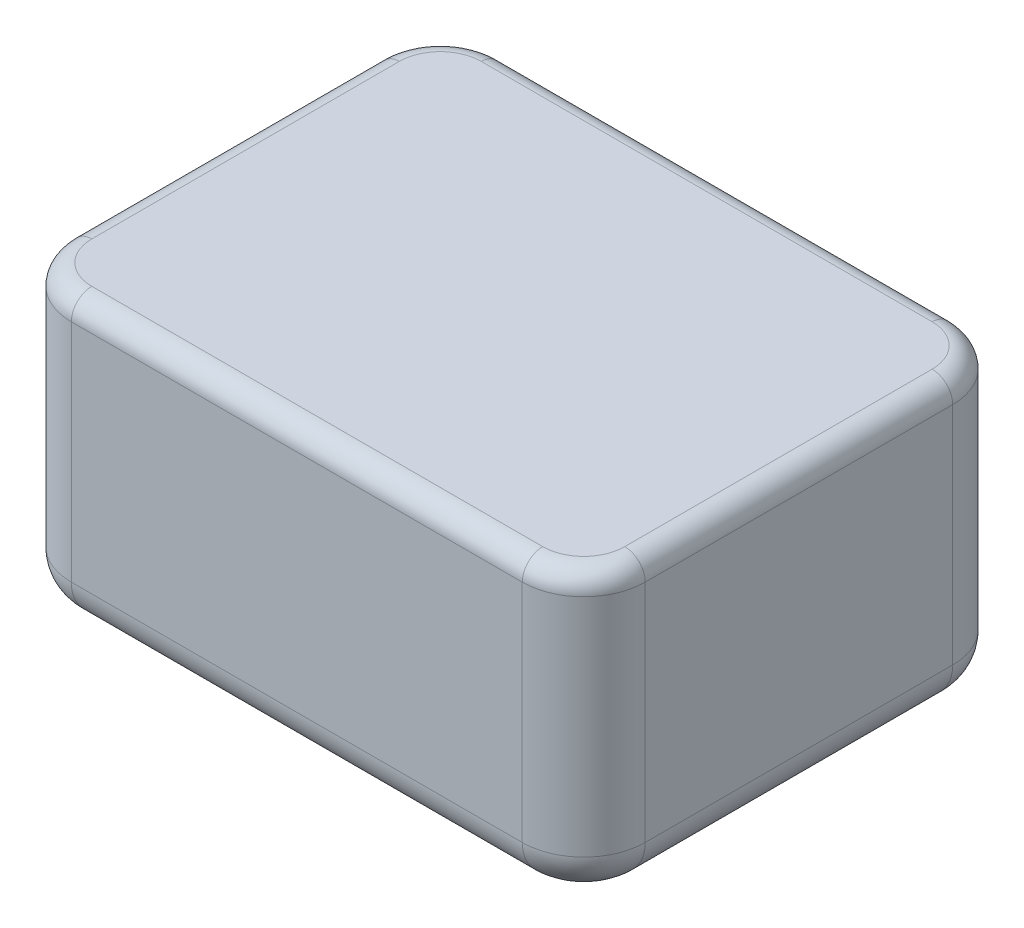
ISO-10303-21;
HEADER;
FILE_DESCRIPTION(('STEP AP214'),'2;1');
FILE_NAME('part.step','',(''),(''),'','','');
FILE_SCHEMA(('AUTOMOTIVE_DESIGN { 1 0 10303 214 1 1 1 1 }'));
ENDSEC;
DATA;
#1=APPLICATION_CONTEXT('core data for automotive mechanical design processes');
#2=APPLICATION_PROTOCOL_DEFINITION('international standard','automotive_design',2000,#1);
#3=PRODUCT_CONTEXT('',#1,'mechanical');
#4=PRODUCT('Part','Part','',(#3));
#5=PRODUCT_RELATED_PRODUCT_CATEGORY('part','',(#4));
#6=PRODUCT_DEFINITION_FORMATION('','',#4);
#7=PRODUCT_DEFINITION_CONTEXT('part definition',#1,'design');
#8=PRODUCT_DEFINITION('design','',#6,#7);
#9=PRODUCT_DEFINITION_SHAPE('','',#8);
#10=(LENGTH_UNIT() NAMED_UNIT(*) SI_UNIT(.MILLI.,.METRE.));
#11=(NAMED_UNIT(*) PLANE_ANGLE_UNIT() SI_UNIT($,.RADIAN.));
#12=(NAMED_UNIT(*) SI_UNIT($,.STERADIAN.) SOLID_ANGLE_UNIT());
#13=UNCERTAINTY_MEASURE_WITH_UNIT(LENGTH_MEASURE(1.E-05),#10,'distance_accuracy_value','');
#14=(GEOMETRIC_REPRESENTATION_CONTEXT(3) GLOBAL_UNCERTAINTY_ASSIGNED_CONTEXT((#13)) GLOBAL_UNIT_ASSIGNED_CONTEXT((#10,
#11,#12)) REPRESENTATION_CONTEXT('',''));
#15=CARTESIAN_POINT('',(0.,0.,0.));
#16=DIRECTION('',(0.,0.,1.));
#17=DIRECTION('',(1.,0.,0.));
#18=AXIS2_PLACEMENT_3D('',#15,#16,#17);
#19=CARTESIAN_POINT('',(-70.,70.,52.5));
#20=DIRECTION('',(1.,0.,0.));
#21=DIRECTION('',(0.,0.,-1.));
#22=AXIS2_PLACEMENT_3D('',#19,#20,#21);
#23=PLANE('',#22);
#24=DIRECTION('',(0.,-1.,0.));
#25=VECTOR('',#24,1.);
#26=CARTESIAN_POINT('',(-70.,70.,37.5));
#27=LINE('',#26,#25);
#28=CARTESIAN_POINT('',(-70.,10.,37.5));
#29=VERTEX_POINT('',#28);
#30=CARTESIAN_POINT('',(-70.,65.,37.5));
#31=VERTEX_POINT('',#30);
#32=EDGE_CURVE('E261',#29,#31,#27,.F.);
#33=ORIENTED_EDGE('',*,*,#32,.T.);
#34=DIRECTION('',(0.,0.,1.));
#35=VECTOR('',#34,1.);
#36=CARTESIAN_POINT('',(-70.,65.,-37.5));
#37=LINE('',#36,#35);
#38=CARTESIAN_POINT('',(-70.,65.,-37.5));
#39=VERTEX_POINT('',#38);
#40=EDGE_CURVE('E66',#31,#39,#37,.F.);
#41=ORIENTED_EDGE('',*,*,#40,.T.);
#42=DIRECTION('',(0.,-1.,0.));
#43=VECTOR('',#42,1.);
#44=CARTESIAN_POINT('',(-70.,70.,-37.5));
#45=LINE('',#44,#43);
#46=CARTESIAN_POINT('',(-70.,10.,-37.5));
#47=VERTEX_POINT('',#46);
#48=EDGE_CURVE('E351',#39,#47,#45,.T.);
#49=ORIENTED_EDGE('',*,*,#48,.T.);
#50=DIRECTION('',(0.,0.,1.));
#51=VECTOR('',#50,1.);
#52=CARTESIAN_POINT('',(-70.,10.,52.5));
#53=LINE('',#52,#51);
#54=EDGE_CURVE('E226',#47,#29,#53,.T.);
#55=ORIENTED_EDGE('',*,*,#54,.T.);
#56=EDGE_LOOP('',(#33,#41,#49,#55));
#57=FACE_BOUND('',#56,.T.);
#58=ADVANCED_FACE('F41',(#57),#23,.F.);
#59=CARTESIAN_POINT('',(70.,70.,52.5));
#60=DIRECTION('',(0.,0.,-1.));
#61=DIRECTION('',(-1.,0.,0.));
#62=AXIS2_PLACEMENT_3D('',#59,#60,#61);
#63=PLANE('',#62);
#64=DIRECTION('',(0.,-1.,0.));
#65=VECTOR('',#64,1.);
#66=CARTESIAN_POINT('',(55.,70.,52.5));
#67=LINE('',#66,#65);
#68=CARTESIAN_POINT('',(55.,10.,52.5));
#69=VERTEX_POINT('',#68);
#70=CARTESIAN_POINT('',(55.,65.,52.5));
#71=VERTEX_POINT('',#70);
#72=EDGE_CURVE('E188',#69,#71,#67,.F.);
#73=ORIENTED_EDGE('',*,*,#72,.T.);
#74=DIRECTION('',(1.,0.,0.));
#75=VECTOR('',#74,1.);
#76=CARTESIAN_POINT('',(-55.,65.,52.5));
#77=LINE('',#76,#75);
#78=CARTESIAN_POINT('',(-55.,65.,52.5));
#79=VERTEX_POINT('',#78);
#80=EDGE_CURVE('E296',#71,#79,#77,.F.);
#81=ORIENTED_EDGE('',*,*,#80,.T.);
#82=DIRECTION('',(0.,-1.,0.));
#83=VECTOR('',#82,1.);
#84=CARTESIAN_POINT('',(-55.,70.,52.5));
#85=LINE('',#84,#83);
#86=CARTESIAN_POINT('',(-55.,10.,52.5));
#87=VERTEX_POINT('',#86);
#88=EDGE_CURVE('E192',#79,#87,#85,.T.);
#89=ORIENTED_EDGE('',*,*,#88,.T.);
#90=DIRECTION('',(1.,0.,0.));
#91=VECTOR('',#90,1.);
#92=CARTESIAN_POINT('',(70.,10.,52.5));
#93=LINE('',#92,#91);
#94=EDGE_CURVE('E229',#87,#69,#93,.T.);
#95=ORIENTED_EDGE('',*,*,#94,.T.);
#96=EDGE_LOOP('',(#73,#81,#89,#95));
#97=FACE_BOUND('',#96,.T.);
#98=ADVANCED_FACE('F370',(#97),#63,.F.);
#99=CARTESIAN_POINT('',(70.,70.,52.5));
#100=DIRECTION('',(-1.,0.,0.));
#101=DIRECTION('',(0.,0.,1.));
#102=AXIS2_PLACEMENT_3D('',#99,#100,#101);
#103=PLANE('',#102);
#104=DIRECTION('',(0.,-1.,0.));
#105=VECTOR('',#104,1.);
#106=CARTESIAN_POINT('',(70.,70.,-37.5));
#107=LINE('',#106,#105);
#108=CARTESIAN_POINT('',(70.,10.,-37.5));
#109=VERTEX_POINT('',#108);
#110=CARTESIAN_POINT('',(70.,65.,-37.5));
#111=VERTEX_POINT('',#110);
#112=EDGE_CURVE('E365',#109,#111,#107,.F.);
#113=ORIENTED_EDGE('',*,*,#112,.T.);
#114=DIRECTION('',(0.,0.,-1.));
#115=VECTOR('',#114,1.);
#116=CARTESIAN_POINT('',(70.,65.,37.5));
#117=LINE('',#116,#115);
#118=CARTESIAN_POINT('',(70.,65.,37.5));
#119=VERTEX_POINT('',#118);
#120=EDGE_CURVE('E290',#111,#119,#117,.F.);
#121=ORIENTED_EDGE('',*,*,#120,.T.);
#122=DIRECTION('',(0.,-1.,0.));
#123=VECTOR('',#122,1.);
#124=CARTESIAN_POINT('',(70.,70.,37.5));
#125=LINE('',#124,#123);
#126=CARTESIAN_POINT('',(70.,10.,37.5));
#127=VERTEX_POINT('',#126);
#128=EDGE_CURVE('E362',#119,#127,#125,.T.);
#129=ORIENTED_EDGE('',*,*,#128,.T.);
#130=DIRECTION('',(0.,0.,-1.));
#131=VECTOR('',#130,1.);
#132=CARTESIAN_POINT('',(70.,10.,52.5));
#133=LINE('',#132,#131);
#134=EDGE_CURVE('E232',#127,#109,#133,.T.);
#135=ORIENTED_EDGE('',*,*,#134,.T.);
#136=EDGE_LOOP('',(#113,#121,#129,#135));
#137=FACE_BOUND('',#136,.T.);
#138=ADVANCED_FACE('F437',(#137),#103,.F.);
#139=CARTESIAN_POINT('',(70.,70.,-52.5));
#140=DIRECTION('',(0.,0.,1.));
#141=DIRECTION('',(1.,0.,0.));
#142=AXIS2_PLACEMENT_3D('',#139,#140,#141);
#143=PLANE('',#142);
#144=DIRECTION('',(0.,-1.,0.));
#145=VECTOR('',#144,1.);
#146=CARTESIAN_POINT('',(-55.,70.,-52.5));
#147=LINE('',#146,#145);
#148=CARTESIAN_POINT('',(-55.,10.,-52.5));
#149=VERTEX_POINT('',#148);
#150=CARTESIAN_POINT('',(-55.,65.,-52.5));
#151=VERTEX_POINT('',#150);
#152=EDGE_CURVE('E359',#149,#151,#147,.F.);
#153=ORIENTED_EDGE('',*,*,#152,.T.);
#154=DIRECTION('',(-1.,0.,0.));
#155=VECTOR('',#154,1.);
#156=CARTESIAN_POINT('',(55.,65.,-52.5));
#157=LINE('',#156,#155);
#158=CARTESIAN_POINT('',(55.,65.,-52.5));
#159=VERTEX_POINT('',#158);
#160=EDGE_CURVE('E11',#151,#159,#157,.F.);
#161=ORIENTED_EDGE('',*,*,#160,.T.);
#162=DIRECTION('',(0.,-1.,0.));
#163=VECTOR('',#162,1.);
#164=CARTESIAN_POINT('',(55.,70.,-52.5));
#165=LINE('',#164,#163);
#166=CARTESIAN_POINT('',(55.,10.,-52.5));
#167=VERTEX_POINT('',#166);
#168=EDGE_CURVE('E354',#159,#167,#165,.T.);
#169=ORIENTED_EDGE('',*,*,#168,.T.);
#170=DIRECTION('',(-1.,0.,0.));
#171=VECTOR('',#170,1.);
#172=CARTESIAN_POINT('',(70.,10.,-52.5));
#173=LINE('',#172,#171);
#174=EDGE_CURVE('E235',#167,#149,#173,.T.);
#175=ORIENTED_EDGE('',*,*,#174,.T.);
#176=EDGE_LOOP('',(#153,#161,#169,#175));
#177=FACE_BOUND('',#176,.T.);
#178=ADVANCED_FACE('F417',(#177),#143,.F.);
#179=CARTESIAN_POINT('',(0.,70.,0.));
#180=DIRECTION('',(0.,1.,0.));
#181=DIRECTION('',(0.,0.,1.));
#182=AXIS2_PLACEMENT_3D('',#179,#180,#181);
#183=PLANE('',#182);
#184=DIRECTION('',(0.,0.,-1.));
#185=VECTOR('',#184,1.);
#186=CARTESIAN_POINT('',(65.,70.,-37.5));
#187=LINE('',#186,#185);
#188=CARTESIAN_POINT('',(65.,70.,37.5));
#189=VERTEX_POINT('',#188);
#190=CARTESIAN_POINT('',(65.,70.,-37.5));
#191=VERTEX_POINT('',#190);
#192=EDGE_CURVE('E279',#189,#191,#187,.T.);
#193=ORIENTED_EDGE('',*,*,#192,.T.);
#194=CARTESIAN_POINT('',(55.,70.,-37.5));
#195=DIRECTION('',(0.,1.,0.));
#196=DIRECTION('',(0.,0.,1.));
#197=AXIS2_PLACEMENT_3D('',#194,#195,#196);
#198=CIRCLE('',#197,10.);
#199=CARTESIAN_POINT('',(55.,70.,-47.5));
#200=VERTEX_POINT('',#199);
#201=EDGE_CURVE('E282',#191,#200,#198,.T.);
#202=ORIENTED_EDGE('',*,*,#201,.T.);
#203=DIRECTION('',(-1.,0.,0.));
#204=VECTOR('',#203,1.);
#205=CARTESIAN_POINT('',(-55.,70.,-47.5));
#206=LINE('',#205,#204);
#207=CARTESIAN_POINT('',(-55.,70.,-47.5));
#208=VERTEX_POINT('',#207);
#209=EDGE_CURVE('E238',#200,#208,#206,.T.);
#210=ORIENTED_EDGE('',*,*,#209,.T.);
#211=CARTESIAN_POINT('',(-55.,70.,-37.5));
#212=DIRECTION('',(0.,1.,0.));
#213=DIRECTION('',(0.,0.,1.));
#214=AXIS2_PLACEMENT_3D('',#211,#212,#213);
#215=CIRCLE('',#214,10.);
#216=CARTESIAN_POINT('',(-65.,70.,-37.5));
#217=VERTEX_POINT('',#216);
#218=EDGE_CURVE('E264',#208,#217,#215,.T.);
#219=ORIENTED_EDGE('',*,*,#218,.T.);
#220=DIRECTION('',(0.,0.,1.));
#221=VECTOR('',#220,1.);
#222=CARTESIAN_POINT('',(-65.,70.,37.5));
#223=LINE('',#222,#221);
#224=CARTESIAN_POINT('',(-65.,70.,37.5));
#225=VERTEX_POINT('',#224);
#226=EDGE_CURVE('E267',#217,#225,#223,.T.);
#227=ORIENTED_EDGE('',*,*,#226,.T.);
#228=CARTESIAN_POINT('',(-55.,70.,37.5));
#229=DIRECTION('',(0.,1.,0.));
#230=DIRECTION('',(0.,0.,1.));
#231=AXIS2_PLACEMENT_3D('',#228,#229,#230);
#232=CIRCLE('',#231,10.);
#233=CARTESIAN_POINT('',(-55.,70.,47.5));
#234=VERTEX_POINT('',#233);
#235=EDGE_CURVE('E270',#225,#234,#232,.T.);
#236=ORIENTED_EDGE('',*,*,#235,.T.);
#237=DIRECTION('',(1.,0.,0.));
#238=VECTOR('',#237,1.);
#239=CARTESIAN_POINT('',(55.,70.,47.5));
#240=LINE('',#239,#238);
#241=CARTESIAN_POINT('',(55.,70.,47.5));
#242=VERTEX_POINT('',#241);
#243=EDGE_CURVE('E273',#234,#242,#240,.T.);
#244=ORIENTED_EDGE('',*,*,#243,.T.);
#245=CARTESIAN_POINT('',(55.,70.,37.5));
#246=DIRECTION('',(0.,1.,0.));
#247=DIRECTION('',(0.,0.,1.));
#248=AXIS2_PLACEMENT_3D('',#245,#246,#247);
#249=CIRCLE('',#248,10.);
#250=EDGE_CURVE('E276',#242,#189,#249,.T.);
#251=ORIENTED_EDGE('',*,*,#250,.T.);
#252=EDGE_LOOP('',(#193,#202,#210,#219,#227,#236,#244,#251));
#253=FACE_BOUND('',#252,.T.);
#254=ADVANCED_FACE('F403',(#253),#183,.T.);
#255=CARTESIAN_POINT('',(0.,0.,0.));
#256=DIRECTION('',(0.,1.,0.));
#257=DIRECTION('',(0.,0.,1.));
#258=AXIS2_PLACEMENT_3D('',#255,#256,#257);
#259=PLANE('',#258);
#260=CARTESIAN_POINT('',(55.,0.,37.5));
#261=DIRECTION('',(0.,1.,0.));
#262=DIRECTION('',(0.,0.,1.));
#263=AXIS2_PLACEMENT_3D('',#260,#261,#262);
#264=CIRCLE('',#263,5.);
#265=CARTESIAN_POINT('',(60.,0.,37.5));
#266=VERTEX_POINT('',#265);
#267=CARTESIAN_POINT('',(55.,0.,42.5));
#268=VERTEX_POINT('',#267);
#269=EDGE_CURVE('E206',#266,#268,#264,.F.);
#270=ORIENTED_EDGE('',*,*,#269,.T.);
#271=DIRECTION('',(1.,0.,0.));
#272=VECTOR('',#271,1.);
#273=CARTESIAN_POINT('',(0.,0.,42.5));
#274=LINE('',#273,#272);
#275=CARTESIAN_POINT('',(-55.,0.,42.5));
#276=VERTEX_POINT('',#275);
#277=EDGE_CURVE('E209',#268,#276,#274,.F.);
#278=ORIENTED_EDGE('',*,*,#277,.T.);
#279=CARTESIAN_POINT('',(-55.,0.,37.5));
#280=DIRECTION('',(0.,1.,0.));
#281=DIRECTION('',(0.,0.,1.));
#282=AXIS2_PLACEMENT_3D('',#279,#280,#281);
#283=CIRCLE('',#282,5.);
#284=CARTESIAN_POINT('',(-60.,0.,37.5));
#285=VERTEX_POINT('',#284);
#286=EDGE_CURVE('E203',#276,#285,#283,.F.);
#287=ORIENTED_EDGE('',*,*,#286,.T.);
#288=DIRECTION('',(0.,0.,1.));
#289=VECTOR('',#288,1.);
#290=CARTESIAN_POINT('',(-60.,0.,0.));
#291=LINE('',#290,#289);
#292=CARTESIAN_POINT('',(-60.,0.,-37.5));
#293=VERTEX_POINT('',#292);
#294=EDGE_CURVE('E164',#285,#293,#291,.F.);
#295=ORIENTED_EDGE('',*,*,#294,.T.);
#296=CARTESIAN_POINT('',(-55.,0.,-37.5));
#297=DIRECTION('',(0.,1.,0.));
#298=DIRECTION('',(0.,0.,1.));
#299=AXIS2_PLACEMENT_3D('',#296,#297,#298);
#300=CIRCLE('',#299,5.);
#301=CARTESIAN_POINT('',(-55.,0.,-42.5));
#302=VERTEX_POINT('',#301);
#303=EDGE_CURVE('E156',#293,#302,#300,.F.);
#304=ORIENTED_EDGE('',*,*,#303,.T.);
#305=DIRECTION('',(-1.,0.,0.));
#306=VECTOR('',#305,1.);
#307=CARTESIAN_POINT('',(0.,0.,-42.5));
#308=LINE('',#307,#306);
#309=CARTESIAN_POINT('',(55.,0.,-42.5));
#310=VERTEX_POINT('',#309);
#311=EDGE_CURVE('E161',#302,#310,#308,.F.);
#312=ORIENTED_EDGE('',*,*,#311,.T.);
#313=CARTESIAN_POINT('',(55.,0.,-37.5));
#314=DIRECTION('',(0.,1.,0.));
#315=DIRECTION('',(0.,0.,1.));
#316=AXIS2_PLACEMENT_3D('',#313,#314,#315);
#317=CIRCLE('',#316,5.);
#318=CARTESIAN_POINT('',(60.,0.,-37.5));
#319=VERTEX_POINT('',#318);
#320=EDGE_CURVE('E169',#310,#319,#317,.F.);
#321=ORIENTED_EDGE('',*,*,#320,.T.);
#322=DIRECTION('',(0.,0.,-1.));
#323=VECTOR('',#322,1.);
#324=CARTESIAN_POINT('',(60.,0.,0.));
#325=LINE('',#324,#323);
#326=EDGE_CURVE('E198',#319,#266,#325,.F.);
#327=ORIENTED_EDGE('',*,*,#326,.T.);
#328=EDGE_LOOP('',(#270,#278,#287,#295,#304,#312,#321,#327));
#329=FACE_BOUND('',#328,.T.);
#330=ADVANCED_FACE('F158',(#329),#259,.F.);
#331=CARTESIAN_POINT('',(-55.,70.,-37.5));
#332=DIRECTION('',(0.,-1.,0.));
#333=DIRECTION('',(0.,0.,-1.));
#334=AXIS2_PLACEMENT_3D('',#331,#332,#333);
#335=CYLINDRICAL_SURFACE('',#334,15.);
#336=ORIENTED_EDGE('',*,*,#48,.F.);
#337=CARTESIAN_POINT('',(-55.,65.,-37.5));
#338=DIRECTION('',(0.,1.,0.));
#339=DIRECTION('',(0.,0.,1.));
#340=AXIS2_PLACEMENT_3D('',#337,#338,#339);
#341=CIRCLE('',#340,15.);
#342=EDGE_CURVE('E51',#39,#151,#341,.F.);
#343=ORIENTED_EDGE('',*,*,#342,.T.);
#344=ORIENTED_EDGE('',*,*,#152,.F.);
#345=CARTESIAN_POINT('',(-55.,10.,-37.5));
#346=DIRECTION('',(0.,1.,0.));
#347=DIRECTION('',(0.,0.,1.));
#348=AXIS2_PLACEMENT_3D('',#345,#346,#347);
#349=CIRCLE('',#348,15.);
#350=EDGE_CURVE('E176',#149,#47,#349,.T.);
#351=ORIENTED_EDGE('',*,*,#350,.T.);
#352=EDGE_LOOP('',(#336,#343,#344,#351));
#353=FACE_BOUND('',#352,.T.);
#354=ADVANCED_FACE('F441',(#353),#335,.T.);
#355=CARTESIAN_POINT('',(55.,70.,-37.5));
#356=DIRECTION('',(0.,-1.,0.));
#357=DIRECTION('',(0.,0.,-1.));
#358=AXIS2_PLACEMENT_3D('',#355,#356,#357);
#359=CYLINDRICAL_SURFACE('',#358,15.);
#360=ORIENTED_EDGE('',*,*,#168,.F.);
#361=CARTESIAN_POINT('',(55.,65.,-37.5));
#362=DIRECTION('',(0.,1.,0.));
#363=DIRECTION('',(0.,0.,1.));
#364=AXIS2_PLACEMENT_3D('',#361,#362,#363);
#365=CIRCLE('',#364,15.);
#366=EDGE_CURVE('E286',#159,#111,#365,.F.);
#367=ORIENTED_EDGE('',*,*,#366,.T.);
#368=ORIENTED_EDGE('',*,*,#112,.F.);
#369=CARTESIAN_POINT('',(55.,10.,-37.5));
#370=DIRECTION('',(0.,1.,0.));
#371=DIRECTION('',(0.,0.,1.));
#372=AXIS2_PLACEMENT_3D('',#369,#370,#371);
#373=CIRCLE('',#372,15.);
#374=EDGE_CURVE('E212',#109,#167,#373,.T.);
#375=ORIENTED_EDGE('',*,*,#374,.T.);
#376=EDGE_LOOP('',(#360,#367,#368,#375));
#377=FACE_BOUND('',#376,.T.);
#378=ADVANCED_FACE('F420',(#377),#359,.T.);
#379=CARTESIAN_POINT('',(55.,70.,37.5));
#380=DIRECTION('',(0.,-1.,0.));
#381=DIRECTION('',(0.,0.,-1.));
#382=AXIS2_PLACEMENT_3D('',#379,#380,#381);
#383=CYLINDRICAL_SURFACE('',#382,15.);
#384=ORIENTED_EDGE('',*,*,#128,.F.);
#385=CARTESIAN_POINT('',(55.,65.,37.5));
#386=DIRECTION('',(0.,1.,0.));
#387=DIRECTION('',(0.,0.,1.));
#388=AXIS2_PLACEMENT_3D('',#385,#386,#387);
#389=CIRCLE('',#388,15.);
#390=EDGE_CURVE('E293',#119,#71,#389,.F.);
#391=ORIENTED_EDGE('',*,*,#390,.T.);
#392=ORIENTED_EDGE('',*,*,#72,.F.);
#393=CARTESIAN_POINT('',(55.,10.,37.5));
#394=DIRECTION('',(0.,1.,0.));
#395=DIRECTION('',(0.,0.,1.));
#396=AXIS2_PLACEMENT_3D('',#393,#394,#395);
#397=CIRCLE('',#396,15.);
#398=EDGE_CURVE('E216',#69,#127,#397,.T.);
#399=ORIENTED_EDGE('',*,*,#398,.T.);
#400=EDGE_LOOP('',(#384,#391,#392,#399));
#401=FACE_BOUND('',#400,.T.);
#402=ADVANCED_FACE('F390',(#401),#383,.T.);
#403=CARTESIAN_POINT('',(-55.,70.,37.5));
#404=DIRECTION('',(0.,-1.,0.));
#405=DIRECTION('',(0.,0.,-1.));
#406=AXIS2_PLACEMENT_3D('',#403,#404,#405);
#407=CYLINDRICAL_SURFACE('',#406,15.);
#408=ORIENTED_EDGE('',*,*,#88,.F.);
#409=CARTESIAN_POINT('',(-55.,65.,37.5));
#410=DIRECTION('',(0.,1.,0.));
#411=DIRECTION('',(0.,0.,1.));
#412=AXIS2_PLACEMENT_3D('',#409,#410,#411);
#413=CIRCLE('',#412,15.);
#414=EDGE_CURVE('E299',#79,#31,#413,.F.);
#415=ORIENTED_EDGE('',*,*,#414,.T.);
#416=ORIENTED_EDGE('',*,*,#32,.F.);
#417=CARTESIAN_POINT('',(-55.,10.,37.5));
#418=DIRECTION('',(0.,1.,0.));
#419=DIRECTION('',(0.,0.,1.));
#420=AXIS2_PLACEMENT_3D('',#417,#418,#419);
#421=CIRCLE('',#420,15.);
#422=EDGE_CURVE('E220',#29,#87,#421,.T.);
#423=ORIENTED_EDGE('',*,*,#422,.T.);
#424=EDGE_LOOP('',(#408,#415,#416,#423));
#425=FACE_BOUND('',#424,.T.);
#426=ADVANCED_FACE('F347',(#425),#407,.T.);
#427=CARTESIAN_POINT('',(-55.,10.,37.5));
#428=DIRECTION('',(0.,1.,0.));
#429=DIRECTION('',(0.,0.,1.));
#430=AXIS2_PLACEMENT_3D('',#427,#428,#429);
#431=DEGENERATE_TOROIDAL_SURFACE('',#430,5.,10.,.T.);
#432=CARTESIAN_POINT('',(-55.,10.,42.5));
#433=DIRECTION('',(1.,0.,0.));
#434=DIRECTION('',(0.,0.,-1.));
#435=AXIS2_PLACEMENT_3D('',#432,#433,#434);
#436=CIRCLE('',#435,10.);
#437=EDGE_CURVE('E253',#87,#276,#436,.T.);
#438=ORIENTED_EDGE('',*,*,#437,.F.);
#439=ORIENTED_EDGE('',*,*,#422,.F.);
#440=CARTESIAN_POINT('',(-60.,10.,37.5));
#441=DIRECTION('',(0.,0.,-1.));
#442=DIRECTION('',(-1.,0.,0.));
#443=AXIS2_PLACEMENT_3D('',#440,#441,#442);
#444=CIRCLE('',#443,10.);
#445=EDGE_CURVE('E257',#285,#29,#444,.T.);
#446=ORIENTED_EDGE('',*,*,#445,.F.);
#447=ORIENTED_EDGE('',*,*,#286,.F.);
#448=EDGE_LOOP('',(#438,#439,#446,#447));
#449=FACE_BOUND('',#448,.T.);
#450=ADVANCED_FACE('F377',(#449),#431,.T.);
#451=CARTESIAN_POINT('',(-60.,10.,52.5));
#452=DIRECTION('',(0.,0.,1.));
#453=DIRECTION('',(1.,0.,0.));
#454=AXIS2_PLACEMENT_3D('',#451,#452,#453);
#455=CYLINDRICAL_SURFACE('',#454,10.);
#456=ORIENTED_EDGE('',*,*,#445,.T.);
#457=ORIENTED_EDGE('',*,*,#54,.F.);
#458=CARTESIAN_POINT('',(-60.,10.,-37.5));
#459=DIRECTION('',(0.,0.,-1.));
#460=DIRECTION('',(-1.,0.,0.));
#461=AXIS2_PLACEMENT_3D('',#458,#459,#460);
#462=CIRCLE('',#461,10.);
#463=EDGE_CURVE('E250',#293,#47,#462,.T.);
#464=ORIENTED_EDGE('',*,*,#463,.F.);
#465=ORIENTED_EDGE('',*,*,#294,.F.);
#466=EDGE_LOOP('',(#456,#457,#464,#465));
#467=FACE_BOUND('',#466,.T.);
#468=ADVANCED_FACE('F466',(#467),#455,.T.);
#469=CARTESIAN_POINT('',(70.,10.,42.5));
#470=DIRECTION('',(1.,0.,0.));
#471=DIRECTION('',(0.,0.,-1.));
#472=AXIS2_PLACEMENT_3D('',#469,#470,#471);
#473=CYLINDRICAL_SURFACE('',#472,10.);
#474=ORIENTED_EDGE('',*,*,#437,.T.);
#475=ORIENTED_EDGE('',*,*,#277,.F.);
#476=CARTESIAN_POINT('',(55.,10.,42.5));
#477=DIRECTION('',(1.,0.,0.));
#478=DIRECTION('',(0.,0.,-1.));
#479=AXIS2_PLACEMENT_3D('',#476,#477,#478);
#480=CIRCLE('',#479,10.);
#481=EDGE_CURVE('E180',#69,#268,#480,.T.);
#482=ORIENTED_EDGE('',*,*,#481,.F.);
#483=ORIENTED_EDGE('',*,*,#94,.F.);
#484=EDGE_LOOP('',(#474,#475,#482,#483));
#485=FACE_BOUND('',#484,.T.);
#486=ADVANCED_FACE('F381',(#485),#473,.T.);
#487=CARTESIAN_POINT('',(-55.,10.,-37.5));
#488=DIRECTION('',(0.,1.,0.));
#489=DIRECTION('',(0.,0.,1.));
#490=AXIS2_PLACEMENT_3D('',#487,#488,#489);
#491=DEGENERATE_TOROIDAL_SURFACE('',#490,5.,10.,.T.);
#492=ORIENTED_EDGE('',*,*,#463,.T.);
#493=ORIENTED_EDGE('',*,*,#350,.F.);
#494=CARTESIAN_POINT('',(-55.,10.,-42.5));
#495=DIRECTION('',(1.,0.,0.));
#496=DIRECTION('',(0.,0.,-1.));
#497=AXIS2_PLACEMENT_3D('',#494,#495,#496);
#498=CIRCLE('',#497,10.);
#499=EDGE_CURVE('E173',#302,#149,#498,.T.);
#500=ORIENTED_EDGE('',*,*,#499,.F.);
#501=ORIENTED_EDGE('',*,*,#303,.F.);
#502=EDGE_LOOP('',(#492,#493,#500,#501));
#503=FACE_BOUND('',#502,.T.);
#504=ADVANCED_FACE('F174',(#503),#491,.T.);
#505=CARTESIAN_POINT('',(55.,10.,37.5));
#506=DIRECTION('',(0.,1.,0.));
#507=DIRECTION('',(0.,0.,1.));
#508=AXIS2_PLACEMENT_3D('',#505,#506,#507);
#509=DEGENERATE_TOROIDAL_SURFACE('',#508,5.,10.,.T.);
#510=ORIENTED_EDGE('',*,*,#481,.T.);
#511=ORIENTED_EDGE('',*,*,#269,.F.);
#512=CARTESIAN_POINT('',(60.,10.,37.5));
#513=DIRECTION('',(0.,0.,-1.));
#514=DIRECTION('',(-1.,0.,0.));
#515=AXIS2_PLACEMENT_3D('',#512,#513,#514);
#516=CIRCLE('',#515,10.);
#517=EDGE_CURVE('E181',#127,#266,#516,.T.);
#518=ORIENTED_EDGE('',*,*,#517,.F.);
#519=ORIENTED_EDGE('',*,*,#398,.F.);
#520=EDGE_LOOP('',(#510,#511,#518,#519));
#521=FACE_BOUND('',#520,.T.);
#522=ADVANCED_FACE('F386',(#521),#509,.T.);
#523=CARTESIAN_POINT('',(70.,10.,-42.5));
#524=DIRECTION('',(-1.,0.,0.));
#525=DIRECTION('',(0.,0.,1.));
#526=AXIS2_PLACEMENT_3D('',#523,#524,#525);
#527=CYLINDRICAL_SURFACE('',#526,10.);
#528=ORIENTED_EDGE('',*,*,#499,.T.);
#529=ORIENTED_EDGE('',*,*,#174,.F.);
#530=CARTESIAN_POINT('',(55.,10.,-42.5));
#531=DIRECTION('',(1.,0.,0.));
#532=DIRECTION('',(0.,0.,-1.));
#533=AXIS2_PLACEMENT_3D('',#530,#531,#532);
#534=CIRCLE('',#533,10.);
#535=EDGE_CURVE('E185',#310,#167,#534,.T.);
#536=ORIENTED_EDGE('',*,*,#535,.F.);
#537=ORIENTED_EDGE('',*,*,#311,.F.);
#538=EDGE_LOOP('',(#528,#529,#536,#537));
#539=FACE_BOUND('',#538,.T.);
#540=ADVANCED_FACE('F183',(#539),#527,.T.);
#541=CARTESIAN_POINT('',(60.,10.,52.5));
#542=DIRECTION('',(0.,0.,-1.));
#543=DIRECTION('',(-1.,0.,0.));
#544=AXIS2_PLACEMENT_3D('',#541,#542,#543);
#545=CYLINDRICAL_SURFACE('',#544,10.);
#546=ORIENTED_EDGE('',*,*,#517,.T.);
#547=ORIENTED_EDGE('',*,*,#326,.F.);
#548=CARTESIAN_POINT('',(60.,10.,-37.5));
#549=DIRECTION('',(0.,0.,-1.));
#550=DIRECTION('',(0.,1.,0.));
#551=AXIS2_PLACEMENT_3D('',#548,#549,#550);
#552=CIRCLE('',#551,10.);
#553=EDGE_CURVE('E239',#109,#319,#552,.T.);
#554=ORIENTED_EDGE('',*,*,#553,.F.);
#555=ORIENTED_EDGE('',*,*,#134,.F.);
#556=EDGE_LOOP('',(#546,#547,#554,#555));
#557=FACE_BOUND('',#556,.T.);
#558=ADVANCED_FACE('F453',(#557),#545,.T.);
#559=CARTESIAN_POINT('',(55.,10.,-37.5));
#560=DIRECTION('',(0.,1.,0.));
#561=DIRECTION('',(0.,0.,1.));
#562=AXIS2_PLACEMENT_3D('',#559,#560,#561);
#563=DEGENERATE_TOROIDAL_SURFACE('',#562,5.,10.,.T.);
#564=ORIENTED_EDGE('',*,*,#535,.T.);
#565=ORIENTED_EDGE('',*,*,#374,.F.);
#566=ORIENTED_EDGE('',*,*,#553,.T.);
#567=ORIENTED_EDGE('',*,*,#320,.F.);
#568=EDGE_LOOP('',(#564,#565,#566,#567));
#569=FACE_BOUND('',#568,.T.);
#570=ADVANCED_FACE('F450',(#569),#563,.T.);
#571=CARTESIAN_POINT('',(-55.,65.,37.5));
#572=DIRECTION('',(0.,1.,0.));
#573=DIRECTION('',(0.,0.,1.));
#574=AXIS2_PLACEMENT_3D('',#571,#572,#573);
#575=TOROIDAL_SURFACE('',#574,10.,5.);
#576=CARTESIAN_POINT('',(-65.,65.,37.5));
#577=DIRECTION('',(0.,0.,-1.));
#578=DIRECTION('',(-1.,0.,0.));
#579=AXIS2_PLACEMENT_3D('',#576,#577,#578);
#580=CIRCLE('',#579,5.);
#581=EDGE_CURVE('E327',#31,#225,#580,.T.);
#582=ORIENTED_EDGE('',*,*,#581,.F.);
#583=ORIENTED_EDGE('',*,*,#414,.F.);
#584=CARTESIAN_POINT('',(-55.,65.,47.5));
#585=DIRECTION('',(1.,0.,0.));
#586=DIRECTION('',(0.,0.,-1.));
#587=AXIS2_PLACEMENT_3D('',#584,#585,#586);
#588=CIRCLE('',#587,5.);
#589=EDGE_CURVE('E45',#234,#79,#588,.T.);
#590=ORIENTED_EDGE('',*,*,#589,.F.);
#591=ORIENTED_EDGE('',*,*,#235,.F.);
#592=EDGE_LOOP('',(#582,#583,#590,#591));
#593=FACE_BOUND('',#592,.T.);
#594=ADVANCED_FACE('F43',(#593),#575,.T.);
#595=CARTESIAN_POINT('',(0.,65.,47.5));
#596=DIRECTION('',(-1.,0.,0.));
#597=DIRECTION('',(0.,0.,1.));
#598=AXIS2_PLACEMENT_3D('',#595,#596,#597);
#599=CYLINDRICAL_SURFACE('',#598,5.);
#600=ORIENTED_EDGE('',*,*,#589,.T.);
#601=ORIENTED_EDGE('',*,*,#80,.F.);
#602=CARTESIAN_POINT('',(55.,65.,47.5));
#603=DIRECTION('',(1.,0.,0.));
#604=DIRECTION('',(0.,0.,-1.));
#605=AXIS2_PLACEMENT_3D('',#602,#603,#604);
#606=CIRCLE('',#605,5.);
#607=EDGE_CURVE('E324',#242,#71,#606,.T.);
#608=ORIENTED_EDGE('',*,*,#607,.F.);
#609=ORIENTED_EDGE('',*,*,#243,.F.);
#610=EDGE_LOOP('',(#600,#601,#608,#609));
#611=FACE_BOUND('',#610,.T.);
#612=ADVANCED_FACE('F339',(#611),#599,.T.);
#613=CARTESIAN_POINT('',(-65.,65.,0.));
#614=DIRECTION('',(0.,0.,-1.));
#615=DIRECTION('',(-1.,0.,0.));
#616=AXIS2_PLACEMENT_3D('',#613,#614,#615);
#617=CYLINDRICAL_SURFACE('',#616,5.);
#618=ORIENTED_EDGE('',*,*,#581,.T.);
#619=ORIENTED_EDGE('',*,*,#226,.F.);
#620=CARTESIAN_POINT('',(-65.,65.,-37.5));
#621=DIRECTION('',(0.,0.,-1.));
#622=DIRECTION('',(-1.,0.,0.));
#623=AXIS2_PLACEMENT_3D('',#620,#621,#622);
#624=CIRCLE('',#623,5.);
#625=EDGE_CURVE('E320',#39,#217,#624,.T.);
#626=ORIENTED_EDGE('',*,*,#625,.F.);
#627=ORIENTED_EDGE('',*,*,#40,.F.);
#628=EDGE_LOOP('',(#618,#619,#626,#627));
#629=FACE_BOUND('',#628,.T.);
#630=ADVANCED_FACE('F406',(#629),#617,.T.);
#631=CARTESIAN_POINT('',(55.,65.,37.5));
#632=DIRECTION('',(0.,1.,0.));
#633=DIRECTION('',(0.,0.,1.));
#634=AXIS2_PLACEMENT_3D('',#631,#632,#633);
#635=TOROIDAL_SURFACE('',#634,10.,5.);
#636=ORIENTED_EDGE('',*,*,#607,.T.);
#637=ORIENTED_EDGE('',*,*,#390,.F.);
#638=CARTESIAN_POINT('',(65.,65.,37.5));
#639=DIRECTION('',(0.,0.,-1.));
#640=DIRECTION('',(-1.,0.,0.));
#641=AXIS2_PLACEMENT_3D('',#638,#639,#640);
#642=CIRCLE('',#641,5.);
#643=EDGE_CURVE('E316',#189,#119,#642,.T.);
#644=ORIENTED_EDGE('',*,*,#643,.F.);
#645=ORIENTED_EDGE('',*,*,#250,.F.);
#646=EDGE_LOOP('',(#636,#637,#644,#645));
#647=FACE_BOUND('',#646,.T.);
#648=ADVANCED_FACE('F394',(#647),#635,.T.);
#649=CARTESIAN_POINT('',(-55.,65.,-37.5));
#650=DIRECTION('',(0.,1.,0.));
#651=DIRECTION('',(0.,0.,1.));
#652=AXIS2_PLACEMENT_3D('',#649,#650,#651);
#653=TOROIDAL_SURFACE('',#652,10.,5.);
#654=ORIENTED_EDGE('',*,*,#625,.T.);
#655=ORIENTED_EDGE('',*,*,#218,.F.);
#656=CARTESIAN_POINT('',(-55.,65.,-47.5));
#657=DIRECTION('',(1.,0.,0.));
#658=DIRECTION('',(0.,0.,-1.));
#659=AXIS2_PLACEMENT_3D('',#656,#657,#658);
#660=CIRCLE('',#659,5.);
#661=EDGE_CURVE('E312',#151,#208,#660,.T.);
#662=ORIENTED_EDGE('',*,*,#661,.F.);
#663=ORIENTED_EDGE('',*,*,#342,.F.);
#664=EDGE_LOOP('',(#654,#655,#662,#663));
#665=FACE_BOUND('',#664,.T.);
#666=ADVANCED_FACE('F408',(#665),#653,.T.);
#667=CARTESIAN_POINT('',(65.,65.,0.));
#668=DIRECTION('',(0.,0.,1.));
#669=DIRECTION('',(1.,0.,0.));
#670=AXIS2_PLACEMENT_3D('',#667,#668,#669);
#671=CYLINDRICAL_SURFACE('',#670,5.);
#672=ORIENTED_EDGE('',*,*,#643,.T.);
#673=ORIENTED_EDGE('',*,*,#120,.F.);
#674=CARTESIAN_POINT('',(65.,65.,-37.5));
#675=DIRECTION('',(0.,0.,-1.));
#676=DIRECTION('',(-1.,0.,0.));
#677=AXIS2_PLACEMENT_3D('',#674,#675,#676);
#678=CIRCLE('',#677,5.);
#679=EDGE_CURVE('E309',#191,#111,#678,.T.);
#680=ORIENTED_EDGE('',*,*,#679,.F.);
#681=ORIENTED_EDGE('',*,*,#192,.F.);
#682=EDGE_LOOP('',(#672,#673,#680,#681));
#683=FACE_BOUND('',#682,.T.);
#684=ADVANCED_FACE('F399',(#683),#671,.T.);
#685=CARTESIAN_POINT('',(0.,65.,-47.5));
#686=DIRECTION('',(1.,0.,0.));
#687=DIRECTION('',(0.,0.,-1.));
#688=AXIS2_PLACEMENT_3D('',#685,#686,#687);
#689=CYLINDRICAL_SURFACE('',#688,5.);
#690=ORIENTED_EDGE('',*,*,#661,.T.);
#691=ORIENTED_EDGE('',*,*,#209,.F.);
#692=CARTESIAN_POINT('',(55.,65.,-47.5));
#693=DIRECTION('',(1.,0.,0.));
#694=DIRECTION('',(0.,0.,-1.));
#695=AXIS2_PLACEMENT_3D('',#692,#693,#694);
#696=CIRCLE('',#695,5.);
#697=EDGE_CURVE('E306',#159,#200,#696,.T.);
#698=ORIENTED_EDGE('',*,*,#697,.F.);
#699=ORIENTED_EDGE('',*,*,#160,.F.);
#700=EDGE_LOOP('',(#690,#691,#698,#699));
#701=FACE_BOUND('',#700,.T.);
#702=ADVANCED_FACE('F414',(#701),#689,.T.);
#703=CARTESIAN_POINT('',(55.,65.,-37.5));
#704=DIRECTION('',(0.,1.,0.));
#705=DIRECTION('',(0.,0.,1.));
#706=AXIS2_PLACEMENT_3D('',#703,#704,#705);
#707=TOROIDAL_SURFACE('',#706,10.,5.);
#708=ORIENTED_EDGE('',*,*,#679,.T.);
#709=ORIENTED_EDGE('',*,*,#366,.F.);
#710=ORIENTED_EDGE('',*,*,#697,.T.);
#711=ORIENTED_EDGE('',*,*,#201,.F.);
#712=EDGE_LOOP('',(#708,#709,#710,#711));
#713=FACE_BOUND('',#712,.T.);
#714=ADVANCED_FACE('F424',(#713),#707,.T.);
#715=CLOSED_SHELL('',(#58,#98,#138,#178,#254,#330,#354,#378,#402,#426,#450,#468,#486,#504,#522,
#540,#558,#570,#594,#612,#630,#648,#666,#684,#702,#714));
#716=MANIFOLD_SOLID_BREP('B2',#715);
#717=ADVANCED_BREP_SHAPE_REPRESENTATION('',(#18,#716),#14);
#718=SHAPE_DEFINITION_REPRESENTATION(#9,#717);
ENDSEC;
END-ISO-10303-21;
